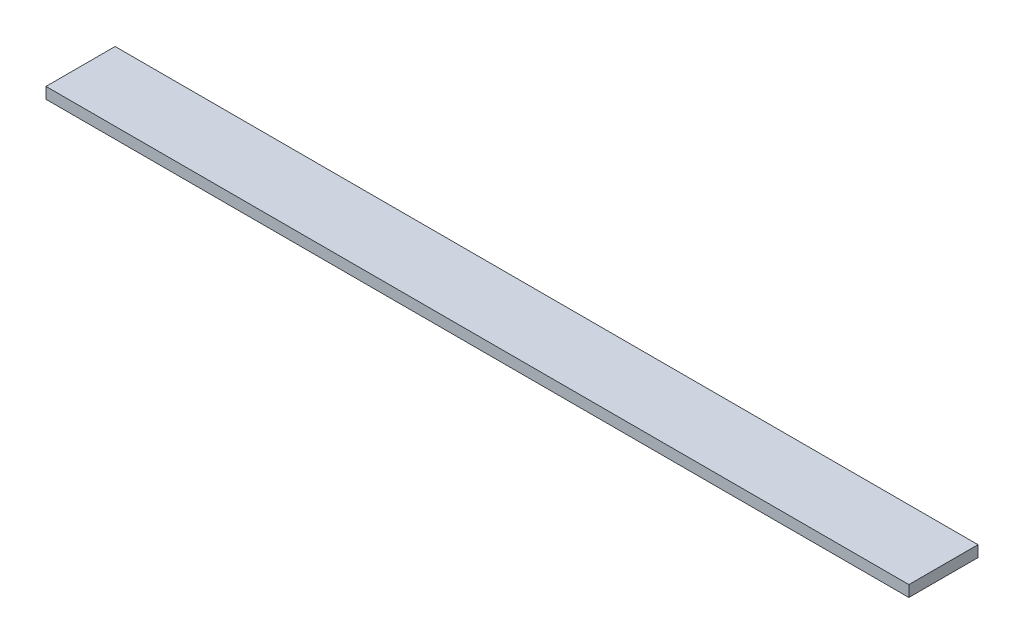
ISO-10303-21;
HEADER;
FILE_DESCRIPTION(('STEP AP214'),'2;1');
FILE_NAME('part.step','',(''),(''),'','','');
FILE_SCHEMA(('AUTOMOTIVE_DESIGN { 1 0 10303 214 1 1 1 1 }'));
ENDSEC;
DATA;
#1=APPLICATION_CONTEXT('core data for automotive mechanical design processes');
#2=APPLICATION_PROTOCOL_DEFINITION('international standard','automotive_design',2000,#1);
#3=PRODUCT_CONTEXT('',#1,'mechanical');
#4=PRODUCT('Part','Part','',(#3));
#5=PRODUCT_RELATED_PRODUCT_CATEGORY('part','',(#4));
#6=PRODUCT_DEFINITION_FORMATION('','',#4);
#7=PRODUCT_DEFINITION_CONTEXT('part definition',#1,'design');
#8=PRODUCT_DEFINITION('design','',#6,#7);
#9=PRODUCT_DEFINITION_SHAPE('','',#8);
#10=(LENGTH_UNIT() NAMED_UNIT(*) SI_UNIT(.MILLI.,.METRE.));
#11=(NAMED_UNIT(*) PLANE_ANGLE_UNIT() SI_UNIT($,.RADIAN.));
#12=(NAMED_UNIT(*) SI_UNIT($,.STERADIAN.) SOLID_ANGLE_UNIT());
#13=UNCERTAINTY_MEASURE_WITH_UNIT(LENGTH_MEASURE(1.E-05),#10,'distance_accuracy_value','');
#14=(GEOMETRIC_REPRESENTATION_CONTEXT(3) GLOBAL_UNCERTAINTY_ASSIGNED_CONTEXT((#13)) GLOBAL_UNIT_ASSIGNED_CONTEXT((#10,
#11,#12)) REPRESENTATION_CONTEXT('',''));
#15=CARTESIAN_POINT('',(0.,0.,0.));
#16=DIRECTION('',(0.,0.,1.));
#17=DIRECTION('',(1.,0.,0.));
#18=AXIS2_PLACEMENT_3D('',#15,#16,#17);
#19=CARTESIAN_POINT('',(-721.173913043478,38.1,-422.058695652174));
#20=DIRECTION('',(1.,0.,0.));
#21=DIRECTION('',(0.,0.,-1.));
#22=AXIS2_PLACEMENT_3D('',#19,#20,#21);
#23=PLANE('',#22);
#24=DIRECTION('',(0.,0.,1.));
#25=VECTOR('',#24,1.);
#26=CARTESIAN_POINT('',(-721.173913043478,0.,-422.058695652174));
#27=LINE('',#26,#25);
#28=CARTESIAN_POINT('',(-721.173913043478,0.,-422.058695652174));
#29=VERTEX_POINT('',#28);
#30=CARTESIAN_POINT('',(-721.173913043478,0.,-187.108695652174));
#31=VERTEX_POINT('',#30);
#32=EDGE_CURVE('E96',#29,#31,#27,.T.);
#33=ORIENTED_EDGE('',*,*,#32,.T.);
#34=DIRECTION('',(0.,-1.,0.));
#35=VECTOR('',#34,1.);
#36=CARTESIAN_POINT('',(-721.173913043478,38.1,-187.108695652174));
#37=LINE('',#36,#35);
#38=CARTESIAN_POINT('',(-721.173913043478,38.1,-187.108695652174));
#39=VERTEX_POINT('',#38);
#40=EDGE_CURVE('E11',#39,#31,#37,.T.);
#41=ORIENTED_EDGE('',*,*,#40,.F.);
#42=DIRECTION('',(0.,0.,1.));
#43=VECTOR('',#42,1.);
#44=CARTESIAN_POINT('',(-721.173913043478,38.1,-422.058695652174));
#45=LINE('',#44,#43);
#46=CARTESIAN_POINT('',(-721.173913043478,38.1,-422.058695652174));
#47=VERTEX_POINT('',#46);
#48=EDGE_CURVE('E82',#47,#39,#45,.T.);
#49=ORIENTED_EDGE('',*,*,#48,.F.);
#50=DIRECTION('',(0.,-1.,0.));
#51=VECTOR('',#50,1.);
#52=CARTESIAN_POINT('',(-721.173913043478,38.1,-422.058695652174));
#53=LINE('',#52,#51);
#54=EDGE_CURVE('E49',#47,#29,#53,.T.);
#55=ORIENTED_EDGE('',*,*,#54,.T.);
#56=EDGE_LOOP('',(#33,#41,#49,#55));
#57=FACE_BOUND('',#56,.T.);
#58=ADVANCED_FACE('F33',(#57),#23,.F.);
#59=CARTESIAN_POINT('',(-721.173913043478,38.1,-187.108695652174));
#60=DIRECTION('',(0.,0.,-1.));
#61=DIRECTION('',(-1.,0.,0.));
#62=AXIS2_PLACEMENT_3D('',#59,#60,#61);
#63=PLANE('',#62);
#64=DIRECTION('',(1.,0.,0.));
#65=VECTOR('',#64,1.);
#66=CARTESIAN_POINT('',(-721.173913043478,0.,-187.108695652174));
#67=LINE('',#66,#65);
#68=CARTESIAN_POINT('',(2212.52608695652,0.,-187.108695652174));
#69=VERTEX_POINT('',#68);
#70=EDGE_CURVE('E87',#31,#69,#67,.T.);
#71=ORIENTED_EDGE('',*,*,#70,.T.);
#72=DIRECTION('',(0.,-1.,0.));
#73=VECTOR('',#72,1.);
#74=CARTESIAN_POINT('',(2212.52608695652,38.1,-187.108695652174));
#75=LINE('',#74,#73);
#76=CARTESIAN_POINT('',(2212.52608695652,38.1,-187.108695652174));
#77=VERTEX_POINT('',#76);
#78=EDGE_CURVE('E41',#77,#69,#75,.T.);
#79=ORIENTED_EDGE('',*,*,#78,.F.);
#80=DIRECTION('',(1.,0.,0.));
#81=VECTOR('',#80,1.);
#82=CARTESIAN_POINT('',(-721.173913043478,38.1,-187.108695652174));
#83=LINE('',#82,#81);
#84=EDGE_CURVE('E74',#39,#77,#83,.T.);
#85=ORIENTED_EDGE('',*,*,#84,.F.);
#86=ORIENTED_EDGE('',*,*,#40,.T.);
#87=EDGE_LOOP('',(#71,#79,#85,#86));
#88=FACE_BOUND('',#87,.T.);
#89=ADVANCED_FACE('F86',(#88),#63,.F.);
#90=CARTESIAN_POINT('',(2212.52608695652,38.1,-422.058695652174));
#91=DIRECTION('',(1.,0.,0.));
#92=DIRECTION('',(0.,0.,-1.));
#93=AXIS2_PLACEMENT_3D('',#90,#91,#92);
#94=PLANE('',#93);
#95=DIRECTION('',(0.,0.,1.));
#96=VECTOR('',#95,1.);
#97=CARTESIAN_POINT('',(2212.52608695652,0.,-422.058695652174));
#98=LINE('',#97,#96);
#99=CARTESIAN_POINT('',(2212.52608695652,0.,-422.058695652174));
#100=VERTEX_POINT('',#99);
#101=EDGE_CURVE('E99',#100,#69,#98,.T.);
#102=ORIENTED_EDGE('',*,*,#101,.F.);
#103=DIRECTION('',(0.,-1.,0.));
#104=VECTOR('',#103,1.);
#105=CARTESIAN_POINT('',(2212.52608695652,38.1,-422.058695652174));
#106=LINE('',#105,#104);
#107=CARTESIAN_POINT('',(2212.52608695652,38.1,-422.058695652174));
#108=VERTEX_POINT('',#107);
#109=EDGE_CURVE('E63',#108,#100,#106,.T.);
#110=ORIENTED_EDGE('',*,*,#109,.F.);
#111=DIRECTION('',(0.,0.,1.));
#112=VECTOR('',#111,1.);
#113=CARTESIAN_POINT('',(2212.52608695652,38.1,-422.058695652174));
#114=LINE('',#113,#112);
#115=EDGE_CURVE('E81',#108,#77,#114,.T.);
#116=ORIENTED_EDGE('',*,*,#115,.T.);
#117=ORIENTED_EDGE('',*,*,#78,.T.);
#118=EDGE_LOOP('',(#102,#110,#116,#117));
#119=FACE_BOUND('',#118,.T.);
#120=ADVANCED_FACE('F90',(#119),#94,.T.);
#121=CARTESIAN_POINT('',(-721.173913043478,38.1,-422.058695652174));
#122=DIRECTION('',(0.,0.,-1.));
#123=DIRECTION('',(-1.,0.,0.));
#124=AXIS2_PLACEMENT_3D('',#121,#122,#123);
#125=PLANE('',#124);
#126=DIRECTION('',(1.,0.,0.));
#127=VECTOR('',#126,1.);
#128=CARTESIAN_POINT('',(-721.173913043478,0.,-422.058695652174));
#129=LINE('',#128,#127);
#130=EDGE_CURVE('E101',#29,#100,#129,.T.);
#131=ORIENTED_EDGE('',*,*,#130,.F.);
#132=ORIENTED_EDGE('',*,*,#54,.F.);
#133=DIRECTION('',(1.,0.,0.));
#134=VECTOR('',#133,1.);
#135=CARTESIAN_POINT('',(-721.173913043478,38.1,-422.058695652174));
#136=LINE('',#135,#134);
#137=EDGE_CURVE('E91',#47,#108,#136,.T.);
#138=ORIENTED_EDGE('',*,*,#137,.T.);
#139=ORIENTED_EDGE('',*,*,#109,.T.);
#140=EDGE_LOOP('',(#131,#132,#138,#139));
#141=FACE_BOUND('',#140,.T.);
#142=ADVANCED_FACE('F107',(#141),#125,.T.);
#143=CARTESIAN_POINT('',(0.,38.1,0.));
#144=DIRECTION('',(0.,1.,0.));
#145=DIRECTION('',(0.,0.,1.));
#146=AXIS2_PLACEMENT_3D('',#143,#144,#145);
#147=PLANE('',#146);
#148=ORIENTED_EDGE('',*,*,#48,.T.);
#149=ORIENTED_EDGE('',*,*,#84,.T.);
#150=ORIENTED_EDGE('',*,*,#115,.F.);
#151=ORIENTED_EDGE('',*,*,#137,.F.);
#152=EDGE_LOOP('',(#148,#149,#150,#151));
#153=FACE_BOUND('',#152,.T.);
#154=ADVANCED_FACE('F78',(#153),#147,.T.);
#155=CARTESIAN_POINT('',(0.,0.,0.));
#156=DIRECTION('',(0.,1.,0.));
#157=DIRECTION('',(0.,0.,1.));
#158=AXIS2_PLACEMENT_3D('',#155,#156,#157);
#159=PLANE('',#158);
#160=ORIENTED_EDGE('',*,*,#32,.F.);
#161=ORIENTED_EDGE('',*,*,#130,.T.);
#162=ORIENTED_EDGE('',*,*,#101,.T.);
#163=ORIENTED_EDGE('',*,*,#70,.F.);
#164=EDGE_LOOP('',(#160,#161,#162,#163));
#165=FACE_BOUND('',#164,.T.);
#166=ADVANCED_FACE('F106',(#165),#159,.F.);
#167=CLOSED_SHELL('',(#58,#89,#120,#142,#154,#166));
#168=MANIFOLD_SOLID_BREP('B2',#167);
#169=ADVANCED_BREP_SHAPE_REPRESENTATION('',(#18,#168),#14);
#170=SHAPE_DEFINITION_REPRESENTATION(#9,#169);
ENDSEC;
END-ISO-10303-21;
